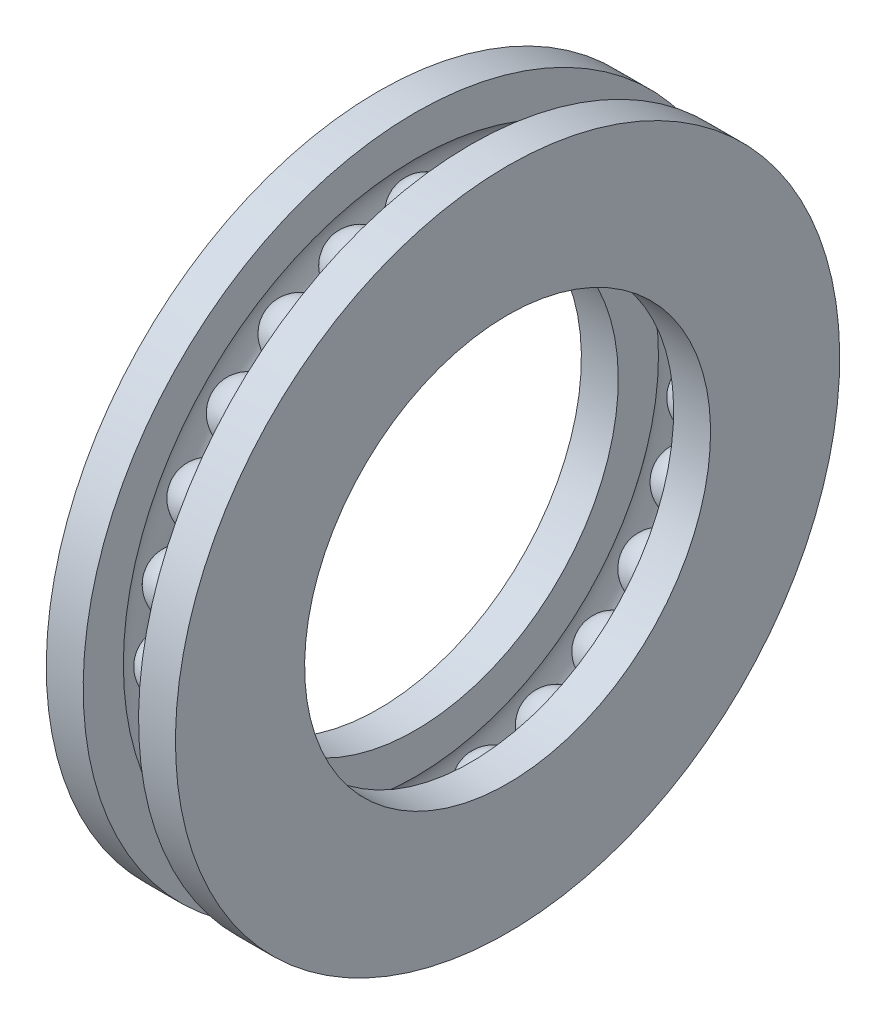
ISO-10303-21;
HEADER;
FILE_DESCRIPTION(('STEP AP214'),'2;1');
FILE_NAME('part.step','',(''),(''),'','','');
FILE_SCHEMA(('AUTOMOTIVE_DESIGN { 1 0 10303 214 1 1 1 1 }'));
ENDSEC;
DATA;
#1=APPLICATION_CONTEXT('core data for automotive mechanical design processes');
#2=APPLICATION_PROTOCOL_DEFINITION('international standard','automotive_design',2000,#1);
#3=PRODUCT_CONTEXT('',#1,'mechanical');
#4=PRODUCT('Part','Part','',(#3));
#5=PRODUCT_RELATED_PRODUCT_CATEGORY('part','',(#4));
#6=PRODUCT_DEFINITION_FORMATION('','',#4);
#7=PRODUCT_DEFINITION_CONTEXT('part definition',#1,'design');
#8=PRODUCT_DEFINITION('design','',#6,#7);
#9=PRODUCT_DEFINITION_SHAPE('','',#8);
#10=(LENGTH_UNIT() NAMED_UNIT(*) SI_UNIT(.MILLI.,.METRE.));
#11=(NAMED_UNIT(*) PLANE_ANGLE_UNIT() SI_UNIT($,.RADIAN.));
#12=(NAMED_UNIT(*) SI_UNIT($,.STERADIAN.) SOLID_ANGLE_UNIT());
#13=UNCERTAINTY_MEASURE_WITH_UNIT(LENGTH_MEASURE(1.E-05),#10,'distance_accuracy_value','');
#14=(GEOMETRIC_REPRESENTATION_CONTEXT(3) GLOBAL_UNCERTAINTY_ASSIGNED_CONTEXT((#13)) GLOBAL_UNIT_ASSIGNED_CONTEXT((#10,
#11,#12)) REPRESENTATION_CONTEXT('',''));
#15=CARTESIAN_POINT('',(0.,0.,0.));
#16=DIRECTION('',(0.,0.,1.));
#17=DIRECTION('',(1.,0.,0.));
#18=AXIS2_PLACEMENT_3D('',#15,#16,#17);
#19=CARTESIAN_POINT('',(-3.74999999999998,39.5571891388307,0.));
#20=DIRECTION('',(1.,0.,0.));
#21=DIRECTION('',(0.,-1.,0.));
#22=AXIS2_PLACEMENT_3D('',#19,#20,#21);
#23=PLANE('',#22);
#24=CARTESIAN_POINT('',(-3.74999999999999,0.,0.));
#25=DIRECTION('',(-1.,0.,0.));
#26=DIRECTION('',(0.,1.,0.));
#27=AXIS2_PLACEMENT_3D('',#24,#25,#26);
#28=CIRCLE('',#27,39.5571891388307);
#29=CARTESIAN_POINT('',(-3.74999999999999,39.5571891388307,0.));
#30=VERTEX_POINT('',#29);
#31=EDGE_CURVE('P0_E10',#30,#30,#28,.T.);
#32=ORIENTED_EDGE('',*,*,#31,.T.);
#33=EDGE_LOOP('',(#32));
#34=FACE_BOUND('',#33,.T.);
#35=CARTESIAN_POINT('',(-3.74999999999999,0.,0.));
#36=DIRECTION('',(-1.,0.,0.));
#37=DIRECTION('',(0.,1.,0.));
#38=AXIS2_PLACEMENT_3D('',#35,#36,#37);
#39=CIRCLE('',#38,45.);
#40=CARTESIAN_POINT('',(-3.74999999999999,45.,0.));
#41=VERTEX_POINT('',#40);
#42=EDGE_CURVE('P0_E37',#41,#41,#39,.T.);
#43=ORIENTED_EDGE('',*,*,#42,.F.);
#44=EDGE_LOOP('',(#43));
#45=FACE_BOUND('',#44,.T.);
#46=ADVANCED_FACE('P0_F15',(#34,#45),#23,.T.);
#47=CARTESIAN_POINT('',(0.,0.,0.));
#48=DIRECTION('',(-1.,0.,0.));
#49=DIRECTION('',(0.,1.,0.));
#50=AXIS2_PLACEMENT_3D('',#47,#48,#49);
#51=TOROIDAL_SURFACE('',#50,36.25,5.);
#52=CARTESIAN_POINT('',(-3.74999999999999,0.,0.));
#53=DIRECTION('',(-1.,0.,0.));
#54=DIRECTION('',(0.,1.,0.));
#55=AXIS2_PLACEMENT_3D('',#52,#53,#54);
#56=CIRCLE('',#55,32.9428108611693);
#57=CARTESIAN_POINT('',(-3.74999999999999,32.9428108611693,0.));
#58=VERTEX_POINT('',#57);
#59=EDGE_CURVE('P0_E21',#58,#58,#56,.T.);
#60=ORIENTED_EDGE('',*,*,#59,.T.);
#61=EDGE_LOOP('',(#60));
#62=FACE_BOUND('',#61,.T.);
#63=ORIENTED_EDGE('',*,*,#31,.F.);
#64=EDGE_LOOP('',(#63));
#65=FACE_BOUND('',#64,.T.);
#66=ADVANCED_FACE('P0_F45',(#62,#65),#51,.F.);
#67=CARTESIAN_POINT('',(-3.74999999999998,27.5,0.));
#68=DIRECTION('',(1.,0.,0.));
#69=DIRECTION('',(0.,-1.,0.));
#70=AXIS2_PLACEMENT_3D('',#67,#68,#69);
#71=PLANE('',#70);
#72=CARTESIAN_POINT('',(-3.74999999999998,0.,0.));
#73=DIRECTION('',(-1.,0.,0.));
#74=DIRECTION('',(0.,1.,0.));
#75=AXIS2_PLACEMENT_3D('',#72,#73,#74);
#76=CIRCLE('',#75,27.5);
#77=CARTESIAN_POINT('',(-3.74999999999998,27.5,0.));
#78=VERTEX_POINT('',#77);
#79=EDGE_CURVE('P0_E25',#78,#78,#76,.T.);
#80=ORIENTED_EDGE('',*,*,#79,.T.);
#81=EDGE_LOOP('',(#80));
#82=FACE_BOUND('',#81,.T.);
#83=ORIENTED_EDGE('',*,*,#59,.F.);
#84=EDGE_LOOP('',(#83));
#85=FACE_BOUND('',#84,.T.);
#86=ADVANCED_FACE('P0_F50',(#82,#85),#71,.T.);
#87=CARTESIAN_POINT('',(-72.7775968739822,0.,0.));
#88=DIRECTION('',(-1.,0.,0.));
#89=DIRECTION('',(0.,1.,0.));
#90=AXIS2_PLACEMENT_3D('',#87,#88,#89);
#91=CYLINDRICAL_SURFACE('',#90,27.5);
#92=CARTESIAN_POINT('',(-8.74999999999999,0.,0.));
#93=DIRECTION('',(-1.,0.,0.));
#94=DIRECTION('',(0.,1.,0.));
#95=AXIS2_PLACEMENT_3D('',#92,#93,#94);
#96=CIRCLE('',#95,27.5);
#97=CARTESIAN_POINT('',(-8.74999999999999,27.5,0.));
#98=VERTEX_POINT('',#97);
#99=EDGE_CURVE('P0_E29',#98,#98,#96,.T.);
#100=ORIENTED_EDGE('',*,*,#99,.T.);
#101=EDGE_LOOP('',(#100));
#102=FACE_BOUND('',#101,.T.);
#103=ORIENTED_EDGE('',*,*,#79,.F.);
#104=EDGE_LOOP('',(#103));
#105=FACE_BOUND('',#104,.T.);
#106=ADVANCED_FACE('P0_F54',(#102,#105),#91,.F.);
#107=CARTESIAN_POINT('',(-8.74999999999999,27.5,0.));
#108=DIRECTION('',(-1.,0.,0.));
#109=DIRECTION('',(0.,1.,0.));
#110=AXIS2_PLACEMENT_3D('',#107,#108,#109);
#111=PLANE('',#110);
#112=CARTESIAN_POINT('',(-8.74999999999999,0.,0.));
#113=DIRECTION('',(-1.,0.,0.));
#114=DIRECTION('',(0.,1.,0.));
#115=AXIS2_PLACEMENT_3D('',#112,#113,#114);
#116=CIRCLE('',#115,45.);
#117=CARTESIAN_POINT('',(-8.74999999999999,45.,0.));
#118=VERTEX_POINT('',#117);
#119=EDGE_CURVE('P0_E34',#118,#118,#116,.T.);
#120=ORIENTED_EDGE('',*,*,#119,.T.);
#121=EDGE_LOOP('',(#120));
#122=FACE_BOUND('',#121,.T.);
#123=ORIENTED_EDGE('',*,*,#99,.F.);
#124=EDGE_LOOP('',(#123));
#125=FACE_BOUND('',#124,.T.);
#126=ADVANCED_FACE('P0_F61',(#122,#125),#111,.T.);
#127=CARTESIAN_POINT('',(-72.7775968739822,0.,0.));
#128=DIRECTION('',(-1.,0.,0.));
#129=DIRECTION('',(0.,1.,0.));
#130=AXIS2_PLACEMENT_3D('',#127,#128,#129);
#131=CYLINDRICAL_SURFACE('',#130,45.);
#132=ORIENTED_EDGE('',*,*,#42,.T.);
#133=EDGE_LOOP('',(#132));
#134=FACE_BOUND('',#133,.T.);
#135=ORIENTED_EDGE('',*,*,#119,.F.);
#136=EDGE_LOOP('',(#135));
#137=FACE_BOUND('',#136,.T.);
#138=ADVANCED_FACE('P0_F41',(#134,#137),#131,.T.);
#139=CLOSED_SHELL('',(#46,#66,#86,#106,#126,#138));
#140=MANIFOLD_SOLID_BREP('P0_B1',#139);
#141=CARTESIAN_POINT('',(0.,0.,0.));
#142=DIRECTION('',(-1.,0.,0.));
#143=DIRECTION('',(0.,1.,0.));
#144=AXIS2_PLACEMENT_3D('',#141,#142,#143);
#145=TOROIDAL_SURFACE('',#144,36.25,4.99999999999998);
#146=CARTESIAN_POINT('',(3.74999999999999,0.,0.));
#147=DIRECTION('',(-1.,0.,0.));
#148=DIRECTION('',(0.,1.,0.));
#149=AXIS2_PLACEMENT_3D('',#146,#147,#148);
#150=CIRCLE('',#149,39.5571891388307);
#151=CARTESIAN_POINT('',(3.74999999999999,39.5571891388307,0.));
#152=VERTEX_POINT('',#151);
#153=EDGE_CURVE('P1_E37',#152,#152,#150,.T.);
#154=ORIENTED_EDGE('',*,*,#153,.T.);
#155=EDGE_LOOP('',(#154));
#156=FACE_BOUND('',#155,.T.);
#157=CARTESIAN_POINT('',(3.74999999999999,0.,0.));
#158=DIRECTION('',(-1.,0.,0.));
#159=DIRECTION('',(0.,1.,0.));
#160=AXIS2_PLACEMENT_3D('',#157,#158,#159);
#161=CIRCLE('',#160,32.9428108611692);
#162=CARTESIAN_POINT('',(3.74999999999999,32.9428108611692,0.));
#163=VERTEX_POINT('',#162);
#164=EDGE_CURVE('P1_E10',#163,#163,#161,.T.);
#165=ORIENTED_EDGE('',*,*,#164,.F.);
#166=EDGE_LOOP('',(#165));
#167=FACE_BOUND('',#166,.T.);
#168=ADVANCED_FACE('P1_F15',(#156,#167),#145,.F.);
#169=CARTESIAN_POINT('',(3.74999999999998,27.4999999999999,0.));
#170=DIRECTION('',(-1.,0.,0.));
#171=DIRECTION('',(0.,1.,0.));
#172=AXIS2_PLACEMENT_3D('',#169,#170,#171);
#173=PLANE('',#172);
#174=ORIENTED_EDGE('',*,*,#164,.T.);
#175=EDGE_LOOP('',(#174));
#176=FACE_BOUND('',#175,.T.);
#177=CARTESIAN_POINT('',(3.74999999999998,0.,0.));
#178=DIRECTION('',(-1.,0.,0.));
#179=DIRECTION('',(0.,1.,0.));
#180=AXIS2_PLACEMENT_3D('',#177,#178,#179);
#181=CIRCLE('',#180,27.4999999999999);
#182=CARTESIAN_POINT('',(3.74999999999998,27.4999999999999,0.));
#183=VERTEX_POINT('',#182);
#184=EDGE_CURVE('P1_E21',#183,#183,#181,.T.);
#185=ORIENTED_EDGE('',*,*,#184,.F.);
#186=EDGE_LOOP('',(#185));
#187=FACE_BOUND('',#186,.T.);
#188=ADVANCED_FACE('P1_F56',(#176,#187),#173,.T.);
#189=CARTESIAN_POINT('',(-72.7775968739822,0.,0.));
#190=DIRECTION('',(-1.,0.,0.));
#191=DIRECTION('',(0.,1.,0.));
#192=AXIS2_PLACEMENT_3D('',#189,#190,#191);
#193=CYLINDRICAL_SURFACE('',#192,27.4999999999999);
#194=ORIENTED_EDGE('',*,*,#184,.T.);
#195=EDGE_LOOP('',(#194));
#196=FACE_BOUND('',#195,.T.);
#197=CARTESIAN_POINT('',(8.74999999999999,0.,0.));
#198=DIRECTION('',(-1.,0.,0.));
#199=DIRECTION('',(0.,1.,0.));
#200=AXIS2_PLACEMENT_3D('',#197,#198,#199);
#201=CIRCLE('',#200,27.4999999999999);
#202=CARTESIAN_POINT('',(8.74999999999999,27.4999999999999,0.));
#203=VERTEX_POINT('',#202);
#204=EDGE_CURVE('P1_E25',#203,#203,#201,.T.);
#205=ORIENTED_EDGE('',*,*,#204,.F.);
#206=EDGE_LOOP('',(#205));
#207=FACE_BOUND('',#206,.T.);
#208=ADVANCED_FACE('P1_F60',(#196,#207),#193,.F.);
#209=CARTESIAN_POINT('',(8.74999999999999,27.4999999999999,0.));
#210=DIRECTION('',(1.,0.,0.));
#211=DIRECTION('',(0.,-1.,0.));
#212=AXIS2_PLACEMENT_3D('',#209,#210,#211);
#213=PLANE('',#212);
#214=ORIENTED_EDGE('',*,*,#204,.T.);
#215=EDGE_LOOP('',(#214));
#216=FACE_BOUND('',#215,.T.);
#217=CARTESIAN_POINT('',(8.74999999999999,0.,0.));
#218=DIRECTION('',(-1.,0.,0.));
#219=DIRECTION('',(0.,1.,0.));
#220=AXIS2_PLACEMENT_3D('',#217,#218,#219);
#221=CIRCLE('',#220,44.9999999999999);
#222=CARTESIAN_POINT('',(8.74999999999999,44.9999999999999,0.));
#223=VERTEX_POINT('',#222);
#224=EDGE_CURVE('P1_E29',#223,#223,#221,.T.);
#225=ORIENTED_EDGE('',*,*,#224,.F.);
#226=EDGE_LOOP('',(#225));
#227=FACE_BOUND('',#226,.T.);
#228=ADVANCED_FACE('P1_F52',(#216,#227),#213,.T.);
#229=CARTESIAN_POINT('',(-72.7775968739822,0.,0.));
#230=DIRECTION('',(-1.,0.,0.));
#231=DIRECTION('',(0.,1.,0.));
#232=AXIS2_PLACEMENT_3D('',#229,#230,#231);
#233=CYLINDRICAL_SURFACE('',#232,44.9999999999999);
#234=ORIENTED_EDGE('',*,*,#224,.T.);
#235=EDGE_LOOP('',(#234));
#236=FACE_BOUND('',#235,.T.);
#237=CARTESIAN_POINT('',(3.74999999999999,0.,0.));
#238=DIRECTION('',(-1.,0.,0.));
#239=DIRECTION('',(0.,1.,0.));
#240=AXIS2_PLACEMENT_3D('',#237,#238,#239);
#241=CIRCLE('',#240,44.9999999999999);
#242=CARTESIAN_POINT('',(3.74999999999999,44.9999999999999,0.));
#243=VERTEX_POINT('',#242);
#244=EDGE_CURVE('P1_E34',#243,#243,#241,.T.);
#245=ORIENTED_EDGE('',*,*,#244,.F.);
#246=EDGE_LOOP('',(#245));
#247=FACE_BOUND('',#246,.T.);
#248=ADVANCED_FACE('P1_F45',(#236,#247),#233,.T.);
#249=CARTESIAN_POINT('',(3.74999999999999,39.5571891388307,0.));
#250=DIRECTION('',(-1.,0.,0.));
#251=DIRECTION('',(0.,1.,0.));
#252=AXIS2_PLACEMENT_3D('',#249,#250,#251);
#253=PLANE('',#252);
#254=ORIENTED_EDGE('',*,*,#244,.T.);
#255=EDGE_LOOP('',(#254));
#256=FACE_BOUND('',#255,.T.);
#257=ORIENTED_EDGE('',*,*,#153,.F.);
#258=EDGE_LOOP('',(#257));
#259=FACE_BOUND('',#258,.T.);
#260=ADVANCED_FACE('P1_F43',(#256,#259),#253,.T.);
#261=CLOSED_SHELL('',(#168,#188,#208,#228,#248,#260));
#262=MANIFOLD_SOLID_BREP('P1_B1',#261);
#263=CARTESIAN_POINT('',(0.,32.7999806518931,-15.434499319234));
#264=DIRECTION('',(0.,0.904827052466018,-0.425779291565077));
#265=DIRECTION('',(0.,-0.425779291565077,-0.904827052466018));
#266=AXIS2_PLACEMENT_3D('',#263,#264,#265);
#267=SPHERICAL_SURFACE('',#266,4.);
#268=CARTESIAN_POINT('',(0.,36.4192888617572,-17.1376164854943));
#269=VERTEX_POINT('',#268);
#270=VERTEX_LOOP('',#269);
#271=FACE_BOUND('',#270,.T.);
#272=ADVANCED_FACE('P2_F13',(#271),#267,.T.);
#273=CLOSED_SHELL('',(#272));
#274=MANIFOLD_SOLID_BREP('P2_B1',#273);
#275=CARTESIAN_POINT('',(0.,27.9311050506222,-23.1066196283901));
#276=DIRECTION('',(0.,0.770513242775786,-0.637423989748694));
#277=DIRECTION('',(0.,-0.637423989748694,-0.770513242775786));
#278=AXIS2_PLACEMENT_3D('',#275,#276,#277);
#279=SPHERICAL_SURFACE('',#278,4.);
#280=CARTESIAN_POINT('',(0.,31.0131580217254,-25.6563155873849));
#281=VERTEX_POINT('',#280);
#282=VERTEX_LOOP('',#281);
#283=FACE_BOUND('',#282,.T.);
#284=ADVANCED_FACE('P3_F13',(#283),#279,.T.);
#285=CLOSED_SHELL('',(#284));
#286=MANIFOLD_SOLID_BREP('P3_B1',#285);
#287=CARTESIAN_POINT('',(0.,21.307215395602,-29.326866046092));
#288=DIRECTION('',(0.,0.587785252292469,-0.809016994374951));
#289=DIRECTION('',(0.,-0.809016994374951,-0.587785252292469));
#290=AXIS2_PLACEMENT_3D('',#287,#288,#289);
#291=SPHERICAL_SURFACE('',#290,4.);
#292=CARTESIAN_POINT('',(0.,23.6583564047719,-32.5629340235918));
#293=VERTEX_POINT('',#292);
#294=VERTEX_LOOP('',#293);
#295=FACE_BOUND('',#294,.T.);
#296=ADVANCED_FACE('P4_F13',(#295),#291,.T.);
#297=CLOSED_SHELL('',(#296));
#298=MANIFOLD_SOLID_BREP('P4_B1',#297);
#299=CARTESIAN_POINT('',(0.,13.3445150348194,-33.7043976134492));
#300=DIRECTION('',(0.,0.368124552684672,-0.929776485888254));
#301=DIRECTION('',(0.,-0.929776485888254,-0.368124552684672));
#302=AXIS2_PLACEMENT_3D('',#299,#300,#301);
#303=SPHERICAL_SURFACE('',#302,4.);
#304=CARTESIAN_POINT('',(0.,14.817013245558,-37.4235035570022));
#305=VERTEX_POINT('',#304);
#306=VERTEX_LOOP('',#305);
#307=FACE_BOUND('',#306,.T.);
#308=ADVANCED_FACE('P5_F13',(#307),#303,.T.);
#309=CLOSED_SHELL('',(#308));
#310=MANIFOLD_SOLID_BREP('P5_B1',#309);
#311=CARTESIAN_POINT('',(0.,4.54332971670578,-35.9641579226498));
#312=DIRECTION('',(0.,0.125333233564297,-0.992114701314479));
#313=DIRECTION('',(0.,-0.992114701314479,-0.125333233564297));
#314=AXIS2_PLACEMENT_3D('',#311,#312,#313);
#315=SPHERICAL_SURFACE('',#314,4.);
#316=CARTESIAN_POINT('',(0.,5.04466265096297,-39.9326167279078));
#317=VERTEX_POINT('',#316);
#318=VERTEX_LOOP('',#317);
#319=FACE_BOUND('',#318,.T.);
#320=ADVANCED_FACE('P6_F13',(#319),#315,.T.);
#321=CLOSED_SHELL('',(#320));
#322=MANIFOLD_SOLID_BREP('P6_B1',#321);
#323=CARTESIAN_POINT('',(0.,-4.54332971670629,-35.9641579226498));
#324=DIRECTION('',(0.,-0.125333233564311,-0.992114701314477));
#325=DIRECTION('',(0.,-0.992114701314477,0.125333233564311));
#326=AXIS2_PLACEMENT_3D('',#323,#324,#325);
#327=SPHERICAL_SURFACE('',#326,4.);
#328=CARTESIAN_POINT('',(0.,-5.04466265096353,-39.9326167279077));
#329=VERTEX_POINT('',#328);
#330=VERTEX_LOOP('',#329);
#331=FACE_BOUND('',#330,.T.);
#332=ADVANCED_FACE('P7_F13',(#331),#327,.T.);
#333=CLOSED_SHELL('',(#332));
#334=MANIFOLD_SOLID_BREP('P7_B1',#333);
#335=CARTESIAN_POINT('',(0.,-13.3445150348198,-33.704397613449));
#336=DIRECTION('',(0.,-0.368124552684685,-0.929776485888248));
#337=DIRECTION('',(0.,-0.929776485888248,0.368124552684685));
#338=AXIS2_PLACEMENT_3D('',#335,#336,#337);
#339=SPHERICAL_SURFACE('',#338,4.);
#340=CARTESIAN_POINT('',(0.,-14.8170132455586,-37.423503557002));
#341=VERTEX_POINT('',#340);
#342=VERTEX_LOOP('',#341);
#343=FACE_BOUND('',#342,.T.);
#344=ADVANCED_FACE('P8_F13',(#343),#339,.T.);
#345=CLOSED_SHELL('',(#344));
#346=MANIFOLD_SOLID_BREP('P8_B1',#345);
#347=CARTESIAN_POINT('',(0.,-21.3072153956024,-29.3268660460917));
#348=DIRECTION('',(0.,-0.58778525229248,-0.809016994374942));
#349=DIRECTION('',(0.,-0.809016994374942,0.58778525229248));
#350=AXIS2_PLACEMENT_3D('',#347,#348,#349);
#351=SPHERICAL_SURFACE('',#350,4.);
#352=CARTESIAN_POINT('',(0.,-23.6583564047723,-32.5629340235914));
#353=VERTEX_POINT('',#352);
#354=VERTEX_LOOP('',#353);
#355=FACE_BOUND('',#354,.T.);
#356=ADVANCED_FACE('P9_F13',(#355),#351,.T.);
#357=CLOSED_SHELL('',(#356));
#358=MANIFOLD_SOLID_BREP('P9_B1',#357);
#359=CARTESIAN_POINT('',(0.,-27.9311050506226,-23.1066196283897));
#360=DIRECTION('',(0.,-0.770513242775795,-0.637423989748683));
#361=DIRECTION('',(0.,-0.637423989748683,0.770513242775795));
#362=AXIS2_PLACEMENT_3D('',#359,#360,#361);
#363=SPHERICAL_SURFACE('',#362,4.);
#364=CARTESIAN_POINT('',(0.,-31.0131580217257,-25.6563155873845));
#365=VERTEX_POINT('',#364);
#366=VERTEX_LOOP('',#365);
#367=FACE_BOUND('',#366,.T.);
#368=ADVANCED_FACE('P10_F13',(#367),#363,.T.);
#369=CLOSED_SHELL('',(#368));
#370=MANIFOLD_SOLID_BREP('P10_B1',#369);
#371=CARTESIAN_POINT('',(0.,-32.7999806518933,-15.4344993192336));
#372=DIRECTION('',(0.,-0.904827052466024,-0.425779291565064));
#373=DIRECTION('',(0.,-0.425779291565064,0.904827052466024));
#374=AXIS2_PLACEMENT_3D('',#371,#372,#373);
#375=SPHERICAL_SURFACE('',#374,4.);
#376=CARTESIAN_POINT('',(0.,-36.4192888617574,-17.1376164854938));
#377=VERTEX_POINT('',#376);
#378=VERTEX_LOOP('',#377);
#379=FACE_BOUND('',#378,.T.);
#380=ADVANCED_FACE('P11_F13',(#379),#375,.T.);
#381=CLOSED_SHELL('',(#380));
#382=MANIFOLD_SOLID_BREP('P11_B1',#381);
#383=CARTESIAN_POINT('',(0.,0.,36.25));
#384=DIRECTION('',(0.,0.,1.));
#385=DIRECTION('',(0.,1.,0.));
#386=AXIS2_PLACEMENT_3D('',#383,#384,#385);
#387=SPHERICAL_SURFACE('',#386,4.);
#388=CARTESIAN_POINT('',(0.,0.,40.25));
#389=VERTEX_POINT('',#388);
#390=VERTEX_LOOP('',#389);
#391=FACE_BOUND('',#390,.T.);
#392=ADVANCED_FACE('P12_F13',(#391),#387,.T.);
#393=CLOSED_SHELL('',(#392));
#394=MANIFOLD_SOLID_BREP('P12_B1',#393);
#395=CARTESIAN_POINT('',(0.,-35.607912838915,-6.79257265373217));
#396=DIRECTION('',(0.,-0.982287250728691,-0.187381314585715));
#397=DIRECTION('',(0.,-0.187381314585715,0.982287250728691));
#398=AXIS2_PLACEMENT_3D('',#395,#396,#397);
#399=SPHERICAL_SURFACE('',#398,4.);
#400=CARTESIAN_POINT('',(0.,-39.5370618418298,-7.54209791207503));
#401=VERTEX_POINT('',#400);
#402=VERTEX_LOOP('',#401);
#403=FACE_BOUND('',#402,.T.);
#404=ADVANCED_FACE('P13_F13',(#403),#399,.T.);
#405=CLOSED_SHELL('',(#404));
#406=MANIFOLD_SOLID_BREP('P13_B1',#405);
#407=CARTESIAN_POINT('',(0.,-36.1784689055248,2.27615633293801));
#408=DIRECTION('',(0.,-0.998026728428271,0.0627905195293244));
#409=DIRECTION('',(0.,0.0627905195293244,0.998026728428271));
#410=AXIS2_PLACEMENT_3D('',#407,#408,#409);
#411=SPHERICAL_SURFACE('',#410,4.);
#412=CARTESIAN_POINT('',(0.,-40.1705758192379,2.52731841105531));
#413=VERTEX_POINT('',#412);
#414=VERTEX_LOOP('',#413);
#415=FACE_BOUND('',#414,.T.);
#416=ADVANCED_FACE('P14_F13',(#415),#411,.T.);
#417=CLOSED_SHELL('',(#416));
#418=MANIFOLD_SOLID_BREP('P14_B1',#417);
#419=CARTESIAN_POINT('',(0.,-34.4757987156992,11.2018660460922));
#420=DIRECTION('',(0.,-0.95105651629515,0.309016994374958));
#421=DIRECTION('',(0.,0.309016994374958,0.95105651629515));
#422=AXIS2_PLACEMENT_3D('',#419,#420,#421);
#423=SPHERICAL_SURFACE('',#422,4.);
#424=CARTESIAN_POINT('',(0.,-38.2800247808798,12.4379340235921));
#425=VERTEX_POINT('',#424);
#426=VERTEX_LOOP('',#425);
#427=FACE_BOUND('',#426,.T.);
#428=ADVANCED_FACE('P15_F13',(#427),#423,.T.);
#429=CLOSED_SHELL('',(#428));
#430=MANIFOLD_SOLID_BREP('P15_B1',#429);
#431=CARTESIAN_POINT('',(0.,-30.6068872994478,19.423721317989));
#432=DIRECTION('',(0.,-0.844327925502009,0.535826794979007));
#433=DIRECTION('',(0.,0.535826794979007,0.844327925502009));
#434=AXIS2_PLACEMENT_3D('',#431,#432,#433);
#435=SPHERICAL_SURFACE('',#434,4.);
#436=CARTESIAN_POINT('',(0.,-33.9841990014559,21.567028497905));
#437=VERTEX_POINT('',#436);
#438=VERTEX_LOOP('',#437);
#439=FACE_BOUND('',#438,.T.);
#440=ADVANCED_FACE('P16_F13',(#439),#435,.T.);
#441=CLOSED_SHELL('',(#440));
#442=MANIFOLD_SOLID_BREP('P16_B1',#441);
#443=CARTESIAN_POINT('',(0.,-24.8148325899146,26.4251127440265));
#444=DIRECTION('',(0.,-0.684547105928679,0.72896862742142));
#445=DIRECTION('',(0.,0.72896862742142,0.684547105928679));
#446=AXIS2_PLACEMENT_3D('',#443,#444,#445);
#447=SPHERICAL_SURFACE('',#446,4.);
#448=CARTESIAN_POINT('',(0.,-27.5530210136293,29.3409872537122));
#449=VERTEX_POINT('',#448);
#450=VERTEX_LOOP('',#449);
#451=FACE_BOUND('',#450,.T.);
#452=ADVANCED_FACE('P17_F13',(#451),#447,.T.);
#453=CLOSED_SHELL('',(#452));
#454=MANIFOLD_SOLID_BREP('P17_B1',#453);
#455=CARTESIAN_POINT('',(0.,-17.4635706861868,31.7661171515903));
#456=DIRECTION('',(0.,-0.481753674101704,0.87630668004387));
#457=DIRECTION('',(0.,0.87630668004387,0.481753674101704));
#458=AXIS2_PLACEMENT_3D('',#455,#456,#457);
#459=SPHERICAL_SURFACE('',#458,4.);
#460=CARTESIAN_POINT('',(0.,-19.3905853825936,35.2713438717658));
#461=VERTEX_POINT('',#460);
#462=VERTEX_LOOP('',#461);
#463=FACE_BOUND('',#462,.T.);
#464=ADVANCED_FACE('P18_F13',(#463),#459,.T.);
#465=CLOSED_SHELL('',(#464));
#466=MANIFOLD_SOLID_BREP('P18_B1',#465);
#467=CARTESIAN_POINT('',(0.,-9.01500840972551,35.111139590913));
#468=DIRECTION('',(0.,-0.248689887164842,0.968583161128635));
#469=DIRECTION('',(0.,0.968583161128635,0.248689887164842));
#470=AXIS2_PLACEMENT_3D('',#467,#468,#469);
#471=SPHERICAL_SURFACE('',#470,4.);
#472=CARTESIAN_POINT('',(0.,-10.0097679583849,38.9854722354275));
#473=VERTEX_POINT('',#472);
#474=VERTEX_LOOP('',#473);
#475=FACE_BOUND('',#474,.T.);
#476=ADVANCED_FACE('P19_F13',(#475),#471,.T.);
#477=CLOSED_SHELL('',(#476));
#478=MANIFOLD_SOLID_BREP('P19_B1',#477);
#479=CARTESIAN_POINT('',(0.,9.01500840972601,35.1111395909129));
#480=DIRECTION('',(0.,0.248689887164855,0.968583161128631));
#481=DIRECTION('',(0.,0.968583161128631,-0.248689887164855));
#482=AXIS2_PLACEMENT_3D('',#479,#480,#481);
#483=SPHERICAL_SURFACE('',#482,4.);
#484=CARTESIAN_POINT('',(0.,10.0097679583854,38.9854722354274));
#485=VERTEX_POINT('',#484);
#486=VERTEX_LOOP('',#485);
#487=FACE_BOUND('',#486,.T.);
#488=ADVANCED_FACE('P20_F13',(#487),#483,.T.);
#489=CLOSED_SHELL('',(#488));
#490=MANIFOLD_SOLID_BREP('P20_B1',#489);
#491=CARTESIAN_POINT('',(0.,17.4635706861872,31.76611715159));
#492=DIRECTION('',(0.,0.481753674101716,0.876306680043863));
#493=DIRECTION('',(0.,0.876306680043863,-0.481753674101716));
#494=AXIS2_PLACEMENT_3D('',#491,#492,#493);
#495=SPHERICAL_SURFACE('',#494,4.);
#496=CARTESIAN_POINT('',(0.,19.3905853825941,35.2713438717655));
#497=VERTEX_POINT('',#496);
#498=VERTEX_LOOP('',#497);
#499=FACE_BOUND('',#498,.T.);
#500=ADVANCED_FACE('P21_F13',(#499),#495,.T.);
#501=CLOSED_SHELL('',(#500));
#502=MANIFOLD_SOLID_BREP('P21_B1',#501);
#503=CARTESIAN_POINT('',(0.,24.814832589915,26.4251127440261));
#504=DIRECTION('',(0.,0.68454710592869,0.72896862742141));
#505=DIRECTION('',(0.,0.72896862742141,-0.68454710592869));
#506=AXIS2_PLACEMENT_3D('',#503,#504,#505);
#507=SPHERICAL_SURFACE('',#506,4.);
#508=CARTESIAN_POINT('',(0.,27.5530210136298,29.3409872537118));
#509=VERTEX_POINT('',#508);
#510=VERTEX_LOOP('',#509);
#511=FACE_BOUND('',#510,.T.);
#512=ADVANCED_FACE('P22_F13',(#511),#507,.T.);
#513=CLOSED_SHELL('',(#512));
#514=MANIFOLD_SOLID_BREP('P22_B1',#513);
#515=CARTESIAN_POINT('',(0.,30.6068872994481,19.4237213179886));
#516=DIRECTION('',(0.,0.844327925502017,0.535826794978995));
#517=DIRECTION('',(0.,0.535826794978995,-0.844327925502017));
#518=AXIS2_PLACEMENT_3D('',#515,#516,#517);
#519=SPHERICAL_SURFACE('',#518,4.);
#520=CARTESIAN_POINT('',(0.,33.9841990014562,21.5670284979045));
#521=VERTEX_POINT('',#520);
#522=VERTEX_LOOP('',#521);
#523=FACE_BOUND('',#522,.T.);
#524=ADVANCED_FACE('P23_F13',(#523),#519,.T.);
#525=CLOSED_SHELL('',(#524));
#526=MANIFOLD_SOLID_BREP('P23_B1',#525);
#527=CARTESIAN_POINT('',(0.,34.4757987156994,11.2018660460917));
#528=DIRECTION('',(0.,0.951056516295155,0.309016994374945));
#529=DIRECTION('',(0.,0.309016994374945,-0.951056516295155));
#530=AXIS2_PLACEMENT_3D('',#527,#528,#529);
#531=SPHERICAL_SURFACE('',#530,4.);
#532=CARTESIAN_POINT('',(0.,38.28002478088,12.4379340235915));
#533=VERTEX_POINT('',#532);
#534=VERTEX_LOOP('',#533);
#535=FACE_BOUND('',#534,.T.);
#536=ADVANCED_FACE('P24_F13',(#535),#531,.T.);
#537=CLOSED_SHELL('',(#536));
#538=MANIFOLD_SOLID_BREP('P24_B1',#537);
#539=CARTESIAN_POINT('',(0.,36.1784689055248,2.27615633293749));
#540=DIRECTION('',(0.,0.998026728428272,0.06279051952931));
#541=DIRECTION('',(0.,0.06279051952931,-0.998026728428272));
#542=AXIS2_PLACEMENT_3D('',#539,#540,#541);
#543=SPHERICAL_SURFACE('',#542,4.);
#544=CARTESIAN_POINT('',(0.,40.1705758192379,2.52731841105473));
#545=VERTEX_POINT('',#544);
#546=VERTEX_LOOP('',#545);
#547=FACE_BOUND('',#546,.T.);
#548=ADVANCED_FACE('P25_F13',(#547),#543,.T.);
#549=CLOSED_SHELL('',(#548));
#550=MANIFOLD_SOLID_BREP('P25_B1',#549);
#551=CARTESIAN_POINT('',(0.,35.6079128389149,-6.79257265373266));
#552=DIRECTION('',(0.,0.982287250728688,-0.187381314585729));
#553=DIRECTION('',(0.,-0.187381314585729,-0.982287250728688));
#554=AXIS2_PLACEMENT_3D('',#551,#552,#553);
#555=SPHERICAL_SURFACE('',#554,4.);
#556=CARTESIAN_POINT('',(0.,39.5370618418297,-7.54209791207557));
#557=VERTEX_POINT('',#556);
#558=VERTEX_LOOP('',#557);
#559=FACE_BOUND('',#558,.T.);
#560=ADVANCED_FACE('P26_F12',(#559),#555,.T.);
#561=CLOSED_SHELL('',(#560));
#562=MANIFOLD_SOLID_BREP('P26_B1',#561);
#563=ADVANCED_BREP_SHAPE_REPRESENTATION('',(#18,#140,#262,#274,#286,#298,#310,#322,#334,#346,
#358,#370,#382,#394,#406,#418,#430,#442,#454,#466,#478,#490,#502,#514,#526,#538,#550,#562),#14);
#564=SHAPE_DEFINITION_REPRESENTATION(#9,#563);
ENDSEC;
END-ISO-10303-21;
